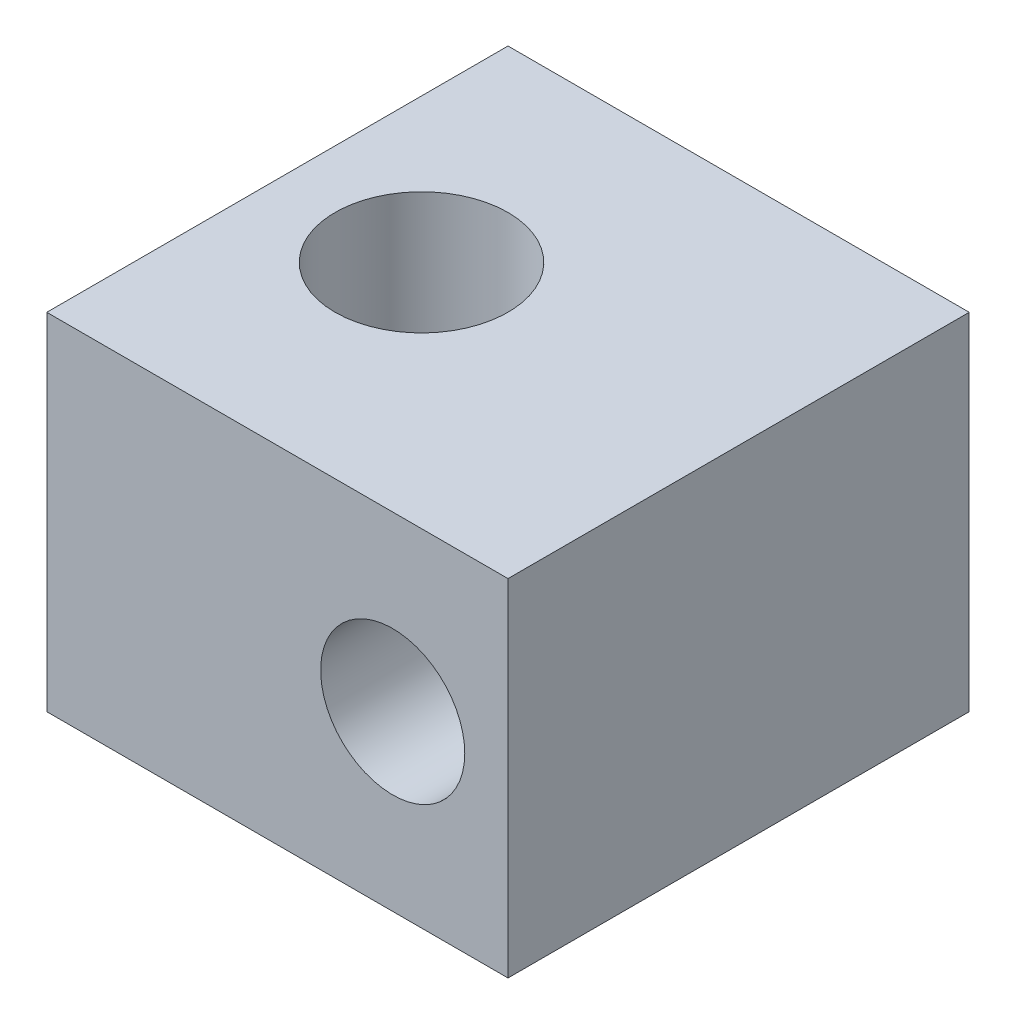
ISO-10303-21;
HEADER;
FILE_DESCRIPTION(('STEP AP214'),'2;1');
FILE_NAME('part.step','',(''),(''),'','','');
FILE_SCHEMA(('AUTOMOTIVE_DESIGN { 1 0 10303 214 1 1 1 1 }'));
ENDSEC;
DATA;
#1=APPLICATION_CONTEXT('core data for automotive mechanical design processes');
#2=APPLICATION_PROTOCOL_DEFINITION('international standard','automotive_design',2000,#1);
#3=PRODUCT_CONTEXT('',#1,'mechanical');
#4=PRODUCT('Part','Part','',(#3));
#5=PRODUCT_RELATED_PRODUCT_CATEGORY('part','',(#4));
#6=PRODUCT_DEFINITION_FORMATION('','',#4);
#7=PRODUCT_DEFINITION_CONTEXT('part definition',#1,'design');
#8=PRODUCT_DEFINITION('design','',#6,#7);
#9=PRODUCT_DEFINITION_SHAPE('','',#8);
#10=(LENGTH_UNIT() NAMED_UNIT(*) SI_UNIT(.MILLI.,.METRE.));
#11=(NAMED_UNIT(*) PLANE_ANGLE_UNIT() SI_UNIT($,.RADIAN.));
#12=(NAMED_UNIT(*) SI_UNIT($,.STERADIAN.) SOLID_ANGLE_UNIT());
#13=UNCERTAINTY_MEASURE_WITH_UNIT(LENGTH_MEASURE(1.E-05),#10,'distance_accuracy_value','');
#14=(GEOMETRIC_REPRESENTATION_CONTEXT(3) GLOBAL_UNCERTAINTY_ASSIGNED_CONTEXT((#13)) GLOBAL_UNIT_ASSIGNED_CONTEXT((#10,
#11,#12)) REPRESENTATION_CONTEXT('',''));
#15=CARTESIAN_POINT('',(0.,0.,0.));
#16=DIRECTION('',(0.,0.,1.));
#17=DIRECTION('',(1.,0.,0.));
#18=AXIS2_PLACEMENT_3D('',#15,#16,#17);
#19=CARTESIAN_POINT('',(0.,12.,0.));
#20=DIRECTION('',(0.,-1.,0.));
#21=DIRECTION('',(0.,0.,-1.));
#22=AXIS2_PLACEMENT_3D('',#19,#20,#21);
#23=PLANE('',#22);
#24=DIRECTION('',(0.,0.,1.));
#25=VECTOR('',#24,1.);
#26=CARTESIAN_POINT('',(-8.,12.,-8.));
#27=LINE('',#26,#25);
#28=CARTESIAN_POINT('',(-8.,12.,-8.));
#29=VERTEX_POINT('',#28);
#30=CARTESIAN_POINT('',(-8.,12.,8.));
#31=VERTEX_POINT('',#30);
#32=EDGE_CURVE('E85',#29,#31,#27,.T.);
#33=ORIENTED_EDGE('',*,*,#32,.T.);
#34=DIRECTION('',(1.,0.,0.));
#35=VECTOR('',#34,1.);
#36=CARTESIAN_POINT('',(8.,12.,8.));
#37=LINE('',#36,#35);
#38=CARTESIAN_POINT('',(8.,12.,8.));
#39=VERTEX_POINT('',#38);
#40=EDGE_CURVE('E80',#31,#39,#37,.T.);
#41=ORIENTED_EDGE('',*,*,#40,.T.);
#42=DIRECTION('',(0.,0.,-1.));
#43=VECTOR('',#42,1.);
#44=CARTESIAN_POINT('',(8.,12.,-8.));
#45=LINE('',#44,#43);
#46=CARTESIAN_POINT('',(8.,12.,-8.));
#47=VERTEX_POINT('',#46);
#48=EDGE_CURVE('E83',#39,#47,#45,.T.);
#49=ORIENTED_EDGE('',*,*,#48,.T.);
#50=DIRECTION('',(-1.,0.,0.));
#51=VECTOR('',#50,1.);
#52=CARTESIAN_POINT('',(8.,12.,-8.));
#53=LINE('',#52,#51);
#54=EDGE_CURVE('E50',#47,#29,#53,.T.);
#55=ORIENTED_EDGE('',*,*,#54,.T.);
#56=EDGE_LOOP('',(#33,#41,#49,#55));
#57=FACE_BOUND('',#56,.T.);
#58=CARTESIAN_POINT('',(-3.,12.,0.));
#59=DIRECTION('',(0.,1.,0.));
#60=DIRECTION('',(0.,0.,1.));
#61=AXIS2_PLACEMENT_3D('',#58,#59,#60);
#62=CIRCLE('',#61,3.);
#63=CARTESIAN_POINT('',(-3.,12.,3.));
#64=VERTEX_POINT('',#63);
#65=EDGE_CURVE('E101',#64,#64,#62,.T.);
#66=ORIENTED_EDGE('',*,*,#65,.F.);
#67=EDGE_LOOP('',(#66));
#68=FACE_BOUND('',#67,.T.);
#69=ADVANCED_FACE('F32',(#57,#68),#23,.F.);
#70=CARTESIAN_POINT('',(0.,0.,0.));
#71=DIRECTION('',(0.,-1.,0.));
#72=DIRECTION('',(0.,0.,-1.));
#73=AXIS2_PLACEMENT_3D('',#70,#71,#72);
#74=PLANE('',#73);
#75=DIRECTION('',(0.,0.,1.));
#76=VECTOR('',#75,1.);
#77=CARTESIAN_POINT('',(-8.,0.,-8.));
#78=LINE('',#77,#76);
#79=CARTESIAN_POINT('',(-8.,0.,-8.));
#80=VERTEX_POINT('',#79);
#81=CARTESIAN_POINT('',(-8.,0.,8.));
#82=VERTEX_POINT('',#81);
#83=EDGE_CURVE('E98',#80,#82,#78,.T.);
#84=ORIENTED_EDGE('',*,*,#83,.F.);
#85=DIRECTION('',(-1.,0.,0.));
#86=VECTOR('',#85,1.);
#87=CARTESIAN_POINT('',(8.,0.,-8.));
#88=LINE('',#87,#86);
#89=CARTESIAN_POINT('',(8.,0.,-8.));
#90=VERTEX_POINT('',#89);
#91=EDGE_CURVE('E73',#90,#80,#88,.T.);
#92=ORIENTED_EDGE('',*,*,#91,.F.);
#93=DIRECTION('',(0.,0.,-1.));
#94=VECTOR('',#93,1.);
#95=CARTESIAN_POINT('',(8.,0.,-8.));
#96=LINE('',#95,#94);
#97=CARTESIAN_POINT('',(8.,0.,8.));
#98=VERTEX_POINT('',#97);
#99=EDGE_CURVE('E67',#98,#90,#96,.T.);
#100=ORIENTED_EDGE('',*,*,#99,.F.);
#101=DIRECTION('',(1.,0.,0.));
#102=VECTOR('',#101,1.);
#103=CARTESIAN_POINT('',(8.,0.,8.));
#104=LINE('',#103,#102);
#105=EDGE_CURVE('E89',#82,#98,#104,.T.);
#106=ORIENTED_EDGE('',*,*,#105,.F.);
#107=EDGE_LOOP('',(#84,#92,#100,#106));
#108=FACE_BOUND('',#107,.T.);
#109=CARTESIAN_POINT('',(-3.,0.,0.));
#110=DIRECTION('',(0.,1.,0.));
#111=DIRECTION('',(0.,0.,1.));
#112=AXIS2_PLACEMENT_3D('',#109,#110,#111);
#113=CIRCLE('',#112,3.);
#114=CARTESIAN_POINT('',(-3.,0.,3.));
#115=VERTEX_POINT('',#114);
#116=EDGE_CURVE('E113',#115,#115,#113,.T.);
#117=ORIENTED_EDGE('',*,*,#116,.T.);
#118=EDGE_LOOP('',(#117));
#119=FACE_BOUND('',#118,.T.);
#120=ADVANCED_FACE('F109',(#108,#119),#74,.T.);
#121=CARTESIAN_POINT('',(-8.,12.,-8.));
#122=DIRECTION('',(1.,0.,0.));
#123=DIRECTION('',(0.,0.,-1.));
#124=AXIS2_PLACEMENT_3D('',#121,#122,#123);
#125=PLANE('',#124);
#126=ORIENTED_EDGE('',*,*,#83,.T.);
#127=DIRECTION('',(0.,-1.,0.));
#128=VECTOR('',#127,1.);
#129=CARTESIAN_POINT('',(-8.,12.,8.));
#130=LINE('',#129,#128);
#131=EDGE_CURVE('E11',#31,#82,#130,.T.);
#132=ORIENTED_EDGE('',*,*,#131,.F.);
#133=ORIENTED_EDGE('',*,*,#32,.F.);
#134=DIRECTION('',(0.,-1.,0.));
#135=VECTOR('',#134,1.);
#136=CARTESIAN_POINT('',(-8.,12.,-8.));
#137=LINE('',#136,#135);
#138=EDGE_CURVE('E94',#29,#80,#137,.T.);
#139=ORIENTED_EDGE('',*,*,#138,.T.);
#140=EDGE_LOOP('',(#126,#132,#133,#139));
#141=FACE_BOUND('',#140,.T.);
#142=ADVANCED_FACE('F34',(#141),#125,.F.);
#143=CARTESIAN_POINT('',(8.,12.,8.));
#144=DIRECTION('',(0.,0.,-1.));
#145=DIRECTION('',(-1.,0.,0.));
#146=AXIS2_PLACEMENT_3D('',#143,#144,#145);
#147=PLANE('',#146);
#148=CARTESIAN_POINT('',(4.,6.,8.));
#149=DIRECTION('',(0.,0.,1.));
#150=DIRECTION('',(1.,0.,0.));
#151=AXIS2_PLACEMENT_3D('',#148,#149,#150);
#152=CIRCLE('',#151,2.5);
#153=CARTESIAN_POINT('',(6.5,6.,8.));
#154=VERTEX_POINT('',#153);
#155=EDGE_CURVE('E118',#154,#154,#152,.T.);
#156=ORIENTED_EDGE('',*,*,#155,.F.);
#157=EDGE_LOOP('',(#156));
#158=FACE_BOUND('',#157,.T.);
#159=ORIENTED_EDGE('',*,*,#105,.T.);
#160=DIRECTION('',(0.,-1.,0.));
#161=VECTOR('',#160,1.);
#162=CARTESIAN_POINT('',(8.,12.,8.));
#163=LINE('',#162,#161);
#164=EDGE_CURVE('E42',#39,#98,#163,.T.);
#165=ORIENTED_EDGE('',*,*,#164,.F.);
#166=ORIENTED_EDGE('',*,*,#40,.F.);
#167=ORIENTED_EDGE('',*,*,#131,.T.);
#168=EDGE_LOOP('',(#159,#165,#166,#167));
#169=FACE_BOUND('',#168,.T.);
#170=ADVANCED_FACE('F88',(#158,#169),#147,.F.);
#171=CARTESIAN_POINT('',(8.,12.,-8.));
#172=DIRECTION('',(-1.,0.,0.));
#173=DIRECTION('',(0.,0.,1.));
#174=AXIS2_PLACEMENT_3D('',#171,#172,#173);
#175=PLANE('',#174);
#176=ORIENTED_EDGE('',*,*,#99,.T.);
#177=DIRECTION('',(0.,-1.,0.));
#178=VECTOR('',#177,1.);
#179=CARTESIAN_POINT('',(8.,12.,-8.));
#180=LINE('',#179,#178);
#181=EDGE_CURVE('E90',#47,#90,#180,.T.);
#182=ORIENTED_EDGE('',*,*,#181,.F.);
#183=ORIENTED_EDGE('',*,*,#48,.F.);
#184=ORIENTED_EDGE('',*,*,#164,.T.);
#185=EDGE_LOOP('',(#176,#182,#183,#184));
#186=FACE_BOUND('',#185,.T.);
#187=ADVANCED_FACE('F92',(#186),#175,.F.);
#188=CARTESIAN_POINT('',(8.,12.,-8.));
#189=DIRECTION('',(0.,0.,1.));
#190=DIRECTION('',(1.,0.,0.));
#191=AXIS2_PLACEMENT_3D('',#188,#189,#190);
#192=PLANE('',#191);
#193=CARTESIAN_POINT('',(4.,6.,-8.));
#194=DIRECTION('',(0.,0.,1.));
#195=DIRECTION('',(1.,0.,0.));
#196=AXIS2_PLACEMENT_3D('',#193,#194,#195);
#197=CIRCLE('',#196,2.5);
#198=CARTESIAN_POINT('',(6.5,6.,-8.));
#199=VERTEX_POINT('',#198);
#200=EDGE_CURVE('E36',#199,#199,#197,.T.);
#201=ORIENTED_EDGE('',*,*,#200,.T.);
#202=EDGE_LOOP('',(#201));
#203=FACE_BOUND('',#202,.T.);
#204=ORIENTED_EDGE('',*,*,#91,.T.);
#205=ORIENTED_EDGE('',*,*,#138,.F.);
#206=ORIENTED_EDGE('',*,*,#54,.F.);
#207=ORIENTED_EDGE('',*,*,#181,.T.);
#208=EDGE_LOOP('',(#204,#205,#206,#207));
#209=FACE_BOUND('',#208,.T.);
#210=ADVANCED_FACE('F106',(#203,#209),#192,.F.);
#211=CARTESIAN_POINT('',(-3.,12.,0.));
#212=DIRECTION('',(0.,-1.,0.));
#213=DIRECTION('',(0.,0.,-1.));
#214=AXIS2_PLACEMENT_3D('',#211,#212,#213);
#215=CYLINDRICAL_SURFACE('',#214,3.);
#216=ORIENTED_EDGE('',*,*,#65,.T.);
#217=EDGE_LOOP('',(#216));
#218=FACE_BOUND('',#217,.T.);
#219=ORIENTED_EDGE('',*,*,#116,.F.);
#220=EDGE_LOOP('',(#219));
#221=FACE_BOUND('',#220,.T.);
#222=ADVANCED_FACE('F128',(#218,#221),#215,.F.);
#223=CARTESIAN_POINT('',(4.,6.,-14.));
#224=DIRECTION('',(0.,0.,1.));
#225=DIRECTION('',(1.,0.,0.));
#226=AXIS2_PLACEMENT_3D('',#223,#224,#225);
#227=CYLINDRICAL_SURFACE('',#226,2.5);
#228=ORIENTED_EDGE('',*,*,#155,.T.);
#229=EDGE_LOOP('',(#228));
#230=FACE_BOUND('',#229,.T.);
#231=ORIENTED_EDGE('',*,*,#200,.F.);
#232=EDGE_LOOP('',(#231));
#233=FACE_BOUND('',#232,.T.);
#234=ADVANCED_FACE('F126',(#230,#233),#227,.F.);
#235=CLOSED_SHELL('',(#69,#120,#142,#170,#187,#210,#222,#234));
#236=MANIFOLD_SOLID_BREP('B2',#235);
#237=ADVANCED_BREP_SHAPE_REPRESENTATION('',(#18,#236),#14);
#238=SHAPE_DEFINITION_REPRESENTATION(#9,#237);
ENDSEC;
END-ISO-10303-21;
